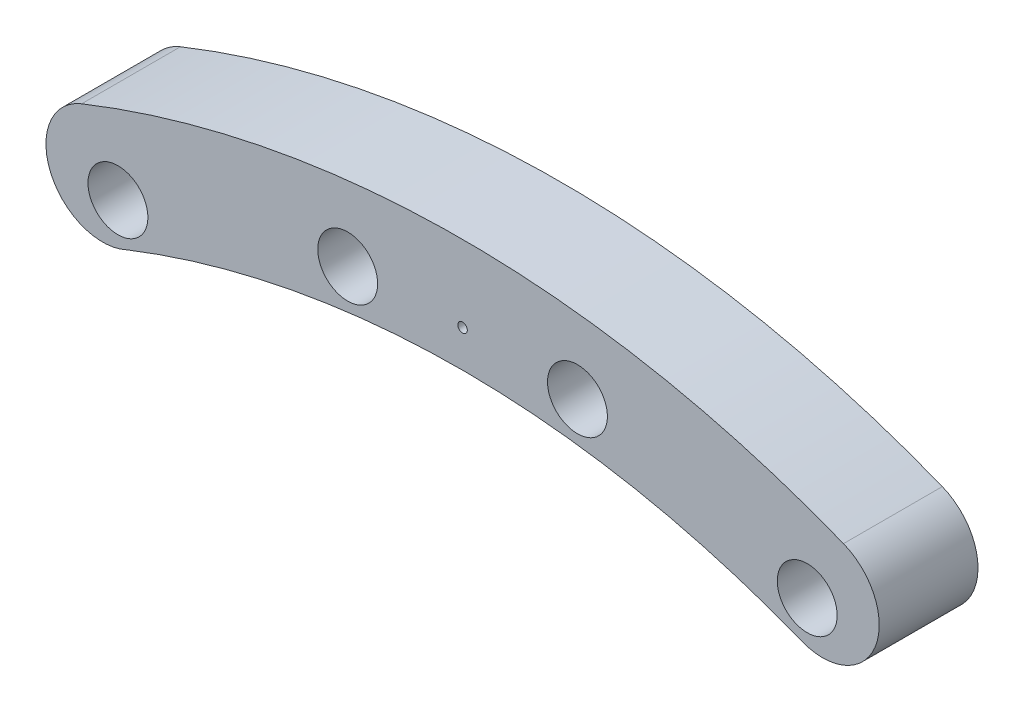
ISO-10303-21;
HEADER;
FILE_DESCRIPTION(('STEP AP214'),'2;1');
FILE_NAME('part.step','',(''),(''),'','','');
FILE_SCHEMA(('AUTOMOTIVE_DESIGN { 1 0 10303 214 1 1 1 1 }'));
ENDSEC;
DATA;
#1=APPLICATION_CONTEXT('core data for automotive mechanical design processes');
#2=APPLICATION_PROTOCOL_DEFINITION('international standard','automotive_design',2000,#1);
#3=PRODUCT_CONTEXT('',#1,'mechanical');
#4=PRODUCT('Part','Part','',(#3));
#5=PRODUCT_RELATED_PRODUCT_CATEGORY('part','',(#4));
#6=PRODUCT_DEFINITION_FORMATION('','',#4);
#7=PRODUCT_DEFINITION_CONTEXT('part definition',#1,'design');
#8=PRODUCT_DEFINITION('design','',#6,#7);
#9=PRODUCT_DEFINITION_SHAPE('','',#8);
#10=(LENGTH_UNIT() NAMED_UNIT(*) SI_UNIT(.MILLI.,.METRE.));
#11=(NAMED_UNIT(*) PLANE_ANGLE_UNIT() SI_UNIT($,.RADIAN.));
#12=(NAMED_UNIT(*) SI_UNIT($,.STERADIAN.) SOLID_ANGLE_UNIT());
#13=UNCERTAINTY_MEASURE_WITH_UNIT(LENGTH_MEASURE(1.E-05),#10,'distance_accuracy_value','');
#14=(GEOMETRIC_REPRESENTATION_CONTEXT(3) GLOBAL_UNCERTAINTY_ASSIGNED_CONTEXT((#13)) GLOBAL_UNIT_ASSIGNED_CONTEXT((#10,
#11,#12)) REPRESENTATION_CONTEXT('',''));
#15=CARTESIAN_POINT('',(0.,0.,0.));
#16=DIRECTION('',(0.,0.,1.));
#17=DIRECTION('',(1.,0.,0.));
#18=AXIS2_PLACEMENT_3D('',#15,#16,#17);
#19=CARTESIAN_POINT('',(-1.36986579460446,152.789859051698,16.383));
#20=DIRECTION('',(0.,0.,1.));
#21=DIRECTION('',(1.,0.,0.));
#22=AXIS2_PLACEMENT_3D('',#19,#20,#21);
#23=PLANE('',#22);
#24=CARTESIAN_POINT('',(55.7798211757139,145.110473428784,16.383));
#25=DIRECTION('',(0.,0.,1.));
#26=DIRECTION('',(1.,0.,0.));
#27=AXIS2_PLACEMENT_3D('',#24,#25,#26);
#28=CIRCLE('',#27,4.96569999999999);
#29=CARTESIAN_POINT('',(60.7455211757139,145.110473428784,16.383));
#30=VERTEX_POINT('',#29);
#31=EDGE_CURVE('E102',#30,#30,#28,.F.);
#32=ORIENTED_EDGE('',*,*,#31,.T.);
#33=EDGE_LOOP('',(#32));
#34=FACE_BOUND('',#33,.T.);
#35=CARTESIAN_POINT('',(-20.4201788242861,154.635473428784,16.383));
#36=DIRECTION('',(0.,0.,1.));
#37=DIRECTION('',(1.,0.,0.));
#38=AXIS2_PLACEMENT_3D('',#35,#36,#37);
#39=CIRCLE('',#38,4.96569999999999);
#40=CARTESIAN_POINT('',(-15.4544788242861,154.635473428784,16.383));
#41=VERTEX_POINT('',#40);
#42=EDGE_CURVE('E105',#41,#41,#39,.F.);
#43=ORIENTED_EDGE('',*,*,#42,.T.);
#44=EDGE_LOOP('',(#43));
#45=FACE_BOUND('',#44,.T.);
#46=CARTESIAN_POINT('',(17.6798211757139,154.635473428784,16.383));
#47=DIRECTION('',(0.,0.,1.));
#48=DIRECTION('',(1.,0.,0.));
#49=AXIS2_PLACEMENT_3D('',#46,#47,#48);
#50=CIRCLE('',#49,4.96569999999999);
#51=CARTESIAN_POINT('',(22.6455211757139,154.635473428784,16.383));
#52=VERTEX_POINT('',#51);
#53=EDGE_CURVE('E108',#52,#52,#50,.F.);
#54=ORIENTED_EDGE('',*,*,#53,.T.);
#55=EDGE_LOOP('',(#54));
#56=FACE_BOUND('',#55,.T.);
#57=CARTESIAN_POINT('',(-58.5201788242861,145.110473428784,16.383));
#58=DIRECTION('',(0.,0.,1.));
#59=DIRECTION('',(1.,0.,0.));
#60=AXIS2_PLACEMENT_3D('',#57,#58,#59);
#61=CIRCLE('',#60,4.96570000000001);
#62=CARTESIAN_POINT('',(-53.5544788242861,145.110473428784,16.383));
#63=VERTEX_POINT('',#62);
#64=EDGE_CURVE('E111',#63,#63,#61,.F.);
#65=ORIENTED_EDGE('',*,*,#64,.T.);
#66=EDGE_LOOP('',(#65));
#67=FACE_BOUND('',#66,.T.);
#68=CARTESIAN_POINT('',(-1.37017882428607,155.397473428784,16.383));
#69=DIRECTION('',(0.,0.,-1.));
#70=DIRECTION('',(0.,1.,0.));
#71=AXIS2_PLACEMENT_3D('',#68,#69,#70);
#72=CIRCLE('',#71,0.787399999999997);
#73=CARTESIAN_POINT('',(-1.37017882428607,156.184873428784,16.383));
#74=VERTEX_POINT('',#73);
#75=EDGE_CURVE('E74',#74,#74,#72,.T.);
#76=ORIENTED_EDGE('',*,*,#75,.T.);
#77=EDGE_LOOP('',(#76));
#78=FACE_BOUND('',#77,.T.);
#79=CARTESIAN_POINT('',(-1.37017882428597,-2.61979960134201,16.383));
#80=DIRECTION('',(0.,0.,1.));
#81=DIRECTION('',(1.,0.,0.));
#82=AXIS2_PLACEMENT_3D('',#79,#80,#81);
#83=CIRCLE('',#82,170.688);
#84=CARTESIAN_POINT('',(-64.5381788242859,155.949419101406,16.383));
#85=VERTEX_POINT('',#84);
#86=CARTESIAN_POINT('',(61.797821175714,155.949419101406,16.383));
#87=VERTEX_POINT('',#86);
#88=EDGE_CURVE('E63',#85,#87,#83,.F.);
#89=ORIENTED_EDGE('',*,*,#88,.F.);
#90=CARTESIAN_POINT('',(-61.0601788242859,147.218673428784,16.383));
#91=DIRECTION('',(0.,0.,1.));
#92=DIRECTION('',(1.,0.,0.));
#93=AXIS2_PLACEMENT_3D('',#90,#91,#92);
#94=CIRCLE('',#93,9.398);
#95=CARTESIAN_POINT('',(-57.0429322824066,138.722548769755,16.383));
#96=VERTEX_POINT('',#95);
#97=EDGE_CURVE('E59',#96,#85,#94,.F.);
#98=ORIENTED_EDGE('',*,*,#97,.F.);
#99=CARTESIAN_POINT('',(-1.39687436906348,-2.70161713696091,16.383));
#100=DIRECTION('',(0.,0.,1.));
#101=DIRECTION('',(1.,0.,0.));
#102=AXIS2_PLACEMENT_3D('',#99,#100,#101);
#103=CIRCLE('',#102,151.977888074896);
#104=CARTESIAN_POINT('',(54.8418211757141,138.487927756163,16.383));
#105=VERTEX_POINT('',#104);
#106=EDGE_CURVE('E62',#96,#105,#103,.F.);
#107=ORIENTED_EDGE('',*,*,#106,.T.);
#108=CARTESIAN_POINT('',(58.319821175714,147.218673428784,16.383));
#109=DIRECTION('',(0.,0.,1.));
#110=DIRECTION('',(1.,0.,0.));
#111=AXIS2_PLACEMENT_3D('',#108,#109,#110);
#112=CIRCLE('',#111,9.398);
#113=EDGE_CURVE('E21',#87,#105,#112,.F.);
#114=ORIENTED_EDGE('',*,*,#113,.F.);
#115=EDGE_LOOP('',(#89,#98,#107,#114));
#116=FACE_BOUND('',#115,.T.);
#117=ADVANCED_FACE('F17',(#34,#45,#56,#67,#78,#116),#23,.T.);
#118=CARTESIAN_POINT('',(58.319821175714,147.218673428784,0.));
#119=DIRECTION('',(0.,0.,1.));
#120=DIRECTION('',(1.,0.,0.));
#121=AXIS2_PLACEMENT_3D('',#118,#119,#120);
#122=CYLINDRICAL_SURFACE('',#121,9.398);
#123=CARTESIAN_POINT('',(58.319821175714,147.218673428784,0.));
#124=DIRECTION('',(0.,0.,1.));
#125=DIRECTION('',(1.,0.,0.));
#126=AXIS2_PLACEMENT_3D('',#123,#124,#125);
#127=CIRCLE('',#126,9.398);
#128=CARTESIAN_POINT('',(54.8418211757141,138.487927756163,0.));
#129=VERTEX_POINT('',#128);
#130=CARTESIAN_POINT('',(61.797821175714,155.949419101406,0.));
#131=VERTEX_POINT('',#130);
#132=EDGE_CURVE('E99',#129,#131,#127,.T.);
#133=ORIENTED_EDGE('',*,*,#132,.T.);
#134=DIRECTION('',(0.,0.,1.));
#135=VECTOR('',#134,1.);
#136=CARTESIAN_POINT('',(61.797821175714,155.949419101406,0.));
#137=LINE('',#136,#135);
#138=EDGE_CURVE('E64',#87,#131,#137,.F.);
#139=ORIENTED_EDGE('',*,*,#138,.F.);
#140=ORIENTED_EDGE('',*,*,#113,.T.);
#141=DIRECTION('',(0.,0.,1.));
#142=VECTOR('',#141,1.);
#143=CARTESIAN_POINT('',(54.8418211757141,138.487927756163,0.));
#144=LINE('',#143,#142);
#145=EDGE_CURVE('E73',#105,#129,#144,.F.);
#146=ORIENTED_EDGE('',*,*,#145,.T.);
#147=EDGE_LOOP('',(#133,#139,#140,#146));
#148=FACE_BOUND('',#147,.T.);
#149=ADVANCED_FACE('F118',(#148),#122,.T.);
#150=CARTESIAN_POINT('',(-1.37017882428597,-2.61979960134201,0.));
#151=DIRECTION('',(0.,0.,1.));
#152=DIRECTION('',(1.,0.,0.));
#153=AXIS2_PLACEMENT_3D('',#150,#151,#152);
#154=CYLINDRICAL_SURFACE('',#153,170.688);
#155=CARTESIAN_POINT('',(-1.37017882428597,-2.61979960134201,0.));
#156=DIRECTION('',(0.,0.,1.));
#157=DIRECTION('',(1.,0.,0.));
#158=AXIS2_PLACEMENT_3D('',#155,#156,#157);
#159=CIRCLE('',#158,170.688);
#160=CARTESIAN_POINT('',(-64.5381788242859,155.949419101406,0.));
#161=VERTEX_POINT('',#160);
#162=EDGE_CURVE('E96',#131,#161,#159,.T.);
#163=ORIENTED_EDGE('',*,*,#162,.T.);
#164=DIRECTION('',(0.,0.,1.));
#165=VECTOR('',#164,1.);
#166=CARTESIAN_POINT('',(-64.538178824286,155.949419101406,0.));
#167=LINE('',#166,#165);
#168=EDGE_CURVE('E40',#85,#161,#167,.F.);
#169=ORIENTED_EDGE('',*,*,#168,.F.);
#170=ORIENTED_EDGE('',*,*,#88,.T.);
#171=ORIENTED_EDGE('',*,*,#138,.T.);
#172=EDGE_LOOP('',(#163,#169,#170,#171));
#173=FACE_BOUND('',#172,.T.);
#174=ADVANCED_FACE('F120',(#173),#154,.T.);
#175=CARTESIAN_POINT('',(-61.0601788242859,147.218673428784,0.));
#176=DIRECTION('',(0.,0.,1.));
#177=DIRECTION('',(1.,0.,0.));
#178=AXIS2_PLACEMENT_3D('',#175,#176,#177);
#179=CYLINDRICAL_SURFACE('',#178,9.398);
#180=ORIENTED_EDGE('',*,*,#168,.T.);
#181=CARTESIAN_POINT('',(-61.0601788242859,147.218673428784,0.));
#182=DIRECTION('',(0.,0.,1.));
#183=DIRECTION('',(1.,0.,0.));
#184=AXIS2_PLACEMENT_3D('',#181,#182,#183);
#185=CIRCLE('',#184,9.398);
#186=CARTESIAN_POINT('',(-57.0429322824066,138.722548769755,0.));
#187=VERTEX_POINT('',#186);
#188=EDGE_CURVE('E34',#161,#187,#185,.T.);
#189=ORIENTED_EDGE('',*,*,#188,.T.);
#190=DIRECTION('',(0.,0.,1.));
#191=VECTOR('',#190,1.);
#192=CARTESIAN_POINT('',(-57.0429322824065,138.722548769756,0.));
#193=LINE('',#192,#191);
#194=EDGE_CURVE('E70',#187,#96,#193,.T.);
#195=ORIENTED_EDGE('',*,*,#194,.T.);
#196=ORIENTED_EDGE('',*,*,#97,.T.);
#197=EDGE_LOOP('',(#180,#189,#195,#196));
#198=FACE_BOUND('',#197,.T.);
#199=ADVANCED_FACE('F76',(#198),#179,.T.);
#200=CARTESIAN_POINT('',(-1.39687436906348,-2.70161713696091,0.));
#201=DIRECTION('',(0.,0.,1.));
#202=DIRECTION('',(1.,0.,0.));
#203=AXIS2_PLACEMENT_3D('',#200,#201,#202);
#204=CYLINDRICAL_SURFACE('',#203,151.977888074896);
#205=ORIENTED_EDGE('',*,*,#194,.F.);
#206=CARTESIAN_POINT('',(-1.39687436906348,-2.70161713696091,0.));
#207=DIRECTION('',(0.,0.,1.));
#208=DIRECTION('',(1.,0.,0.));
#209=AXIS2_PLACEMENT_3D('',#206,#207,#208);
#210=CIRCLE('',#209,151.977888074896);
#211=EDGE_CURVE('E93',#187,#129,#210,.F.);
#212=ORIENTED_EDGE('',*,*,#211,.T.);
#213=ORIENTED_EDGE('',*,*,#145,.F.);
#214=ORIENTED_EDGE('',*,*,#106,.F.);
#215=EDGE_LOOP('',(#205,#212,#213,#214));
#216=FACE_BOUND('',#215,.T.);
#217=ADVANCED_FACE('F68',(#216),#204,.F.);
#218=CARTESIAN_POINT('',(-1.37017882428607,155.397473428784,16.383));
#219=DIRECTION('',(0.,0.,-1.));
#220=DIRECTION('',(0.,1.,0.));
#221=AXIS2_PLACEMENT_3D('',#218,#219,#220);
#222=CYLINDRICAL_SURFACE('',#221,0.787399999999997);
#223=CARTESIAN_POINT('',(-1.37017882428614,155.397473428784,0.));
#224=DIRECTION('',(0.,0.,-1.));
#225=DIRECTION('',(0.,1.,0.));
#226=AXIS2_PLACEMENT_3D('',#223,#224,#225);
#227=CIRCLE('',#226,0.787399999999997);
#228=CARTESIAN_POINT('',(-1.37017882428614,156.184873428784,0.));
#229=VERTEX_POINT('',#228);
#230=EDGE_CURVE('E90',#229,#229,#227,.T.);
#231=ORIENTED_EDGE('',*,*,#230,.T.);
#232=EDGE_LOOP('',(#231));
#233=FACE_BOUND('',#232,.T.);
#234=ORIENTED_EDGE('',*,*,#75,.F.);
#235=EDGE_LOOP('',(#234));
#236=FACE_BOUND('',#235,.T.);
#237=ADVANCED_FACE('F137',(#233,#236),#222,.F.);
#238=CARTESIAN_POINT('',(-58.5201788242861,145.110473428784,16.383));
#239=DIRECTION('',(0.,0.,-1.));
#240=DIRECTION('',(-1.,0.,0.));
#241=AXIS2_PLACEMENT_3D('',#238,#239,#240);
#242=CYLINDRICAL_SURFACE('',#241,4.96570000000001);
#243=CARTESIAN_POINT('',(-58.5201788242861,145.110473428784,0.));
#244=DIRECTION('',(0.,0.,-1.));
#245=DIRECTION('',(-1.,0.,0.));
#246=AXIS2_PLACEMENT_3D('',#243,#244,#245);
#247=CIRCLE('',#246,4.96570000000001);
#248=CARTESIAN_POINT('',(-63.4858788242861,145.110473428784,0.));
#249=VERTEX_POINT('',#248);
#250=EDGE_CURVE('E87',#249,#249,#247,.T.);
#251=ORIENTED_EDGE('',*,*,#250,.T.);
#252=EDGE_LOOP('',(#251));
#253=FACE_BOUND('',#252,.T.);
#254=ORIENTED_EDGE('',*,*,#64,.F.);
#255=EDGE_LOOP('',(#254));
#256=FACE_BOUND('',#255,.T.);
#257=ADVANCED_FACE('F149',(#253,#256),#242,.F.);
#258=CARTESIAN_POINT('',(17.6798211757139,154.635473428784,16.383));
#259=DIRECTION('',(0.,0.,-1.));
#260=DIRECTION('',(0.,1.,0.));
#261=AXIS2_PLACEMENT_3D('',#258,#259,#260);
#262=CYLINDRICAL_SURFACE('',#261,4.96569999999999);
#263=CARTESIAN_POINT('',(17.6798211757139,154.635473428784,0.));
#264=DIRECTION('',(0.,0.,-1.));
#265=DIRECTION('',(0.,1.,0.));
#266=AXIS2_PLACEMENT_3D('',#263,#264,#265);
#267=CIRCLE('',#266,4.96569999999999);
#268=CARTESIAN_POINT('',(17.6798211757139,159.601173428784,0.));
#269=VERTEX_POINT('',#268);
#270=EDGE_CURVE('E84',#269,#269,#267,.T.);
#271=ORIENTED_EDGE('',*,*,#270,.T.);
#272=EDGE_LOOP('',(#271));
#273=FACE_BOUND('',#272,.T.);
#274=ORIENTED_EDGE('',*,*,#53,.F.);
#275=EDGE_LOOP('',(#274));
#276=FACE_BOUND('',#275,.T.);
#277=ADVANCED_FACE('F153',(#273,#276),#262,.F.);
#278=CARTESIAN_POINT('',(-20.4201788242861,154.635473428784,16.383));
#279=DIRECTION('',(0.,0.,-1.));
#280=DIRECTION('',(0.,1.,0.));
#281=AXIS2_PLACEMENT_3D('',#278,#279,#280);
#282=CYLINDRICAL_SURFACE('',#281,4.96569999999999);
#283=CARTESIAN_POINT('',(-20.4201788242861,154.635473428784,0.));
#284=DIRECTION('',(0.,0.,-1.));
#285=DIRECTION('',(0.,1.,0.));
#286=AXIS2_PLACEMENT_3D('',#283,#284,#285);
#287=CIRCLE('',#286,4.96569999999999);
#288=CARTESIAN_POINT('',(-20.4201788242861,159.601173428784,0.));
#289=VERTEX_POINT('',#288);
#290=EDGE_CURVE('E26',#289,#289,#287,.T.);
#291=ORIENTED_EDGE('',*,*,#290,.T.);
#292=EDGE_LOOP('',(#291));
#293=FACE_BOUND('',#292,.T.);
#294=ORIENTED_EDGE('',*,*,#42,.F.);
#295=EDGE_LOOP('',(#294));
#296=FACE_BOUND('',#295,.T.);
#297=ADVANCED_FACE('F130',(#293,#296),#282,.F.);
#298=CARTESIAN_POINT('',(55.7798211757139,145.110473428784,16.383));
#299=DIRECTION('',(0.,0.,-1.));
#300=DIRECTION('',(0.,1.,0.));
#301=AXIS2_PLACEMENT_3D('',#298,#299,#300);
#302=CYLINDRICAL_SURFACE('',#301,4.96569999999999);
#303=CARTESIAN_POINT('',(55.7798211757139,145.110473428784,0.));
#304=DIRECTION('',(0.,0.,-1.));
#305=DIRECTION('',(0.,1.,0.));
#306=AXIS2_PLACEMENT_3D('',#303,#304,#305);
#307=CIRCLE('',#306,4.96569999999999);
#308=CARTESIAN_POINT('',(55.7798211757139,150.076173428784,0.));
#309=VERTEX_POINT('',#308);
#310=EDGE_CURVE('E11',#309,#309,#307,.T.);
#311=ORIENTED_EDGE('',*,*,#310,.T.);
#312=EDGE_LOOP('',(#311));
#313=FACE_BOUND('',#312,.T.);
#314=ORIENTED_EDGE('',*,*,#31,.F.);
#315=EDGE_LOOP('',(#314));
#316=FACE_BOUND('',#315,.T.);
#317=ADVANCED_FACE('F19',(#313,#316),#302,.F.);
#318=CARTESIAN_POINT('',(-1.36986579460446,152.789859051698,0.));
#319=DIRECTION('',(0.,0.,1.));
#320=DIRECTION('',(1.,0.,0.));
#321=AXIS2_PLACEMENT_3D('',#318,#319,#320);
#322=PLANE('',#321);
#323=ORIENTED_EDGE('',*,*,#310,.F.);
#324=EDGE_LOOP('',(#323));
#325=FACE_BOUND('',#324,.T.);
#326=ORIENTED_EDGE('',*,*,#290,.F.);
#327=EDGE_LOOP('',(#326));
#328=FACE_BOUND('',#327,.T.);
#329=ORIENTED_EDGE('',*,*,#270,.F.);
#330=EDGE_LOOP('',(#329));
#331=FACE_BOUND('',#330,.T.);
#332=ORIENTED_EDGE('',*,*,#250,.F.);
#333=EDGE_LOOP('',(#332));
#334=FACE_BOUND('',#333,.T.);
#335=ORIENTED_EDGE('',*,*,#230,.F.);
#336=EDGE_LOOP('',(#335));
#337=FACE_BOUND('',#336,.T.);
#338=ORIENTED_EDGE('',*,*,#211,.F.);
#339=ORIENTED_EDGE('',*,*,#188,.F.);
#340=ORIENTED_EDGE('',*,*,#162,.F.);
#341=ORIENTED_EDGE('',*,*,#132,.F.);
#342=EDGE_LOOP('',(#338,#339,#340,#341));
#343=FACE_BOUND('',#342,.T.);
#344=ADVANCED_FACE('F122',(#325,#328,#331,#334,#337,#343),#322,.F.);
#345=CLOSED_SHELL('',(#117,#149,#174,#199,#217,#237,#257,#277,#297,#317,#344));
#346=MANIFOLD_SOLID_BREP('B1',#345);
#347=ADVANCED_BREP_SHAPE_REPRESENTATION('',(#18,#346),#14);
#348=SHAPE_DEFINITION_REPRESENTATION(#9,#347);
ENDSEC;
END-ISO-10303-21;
